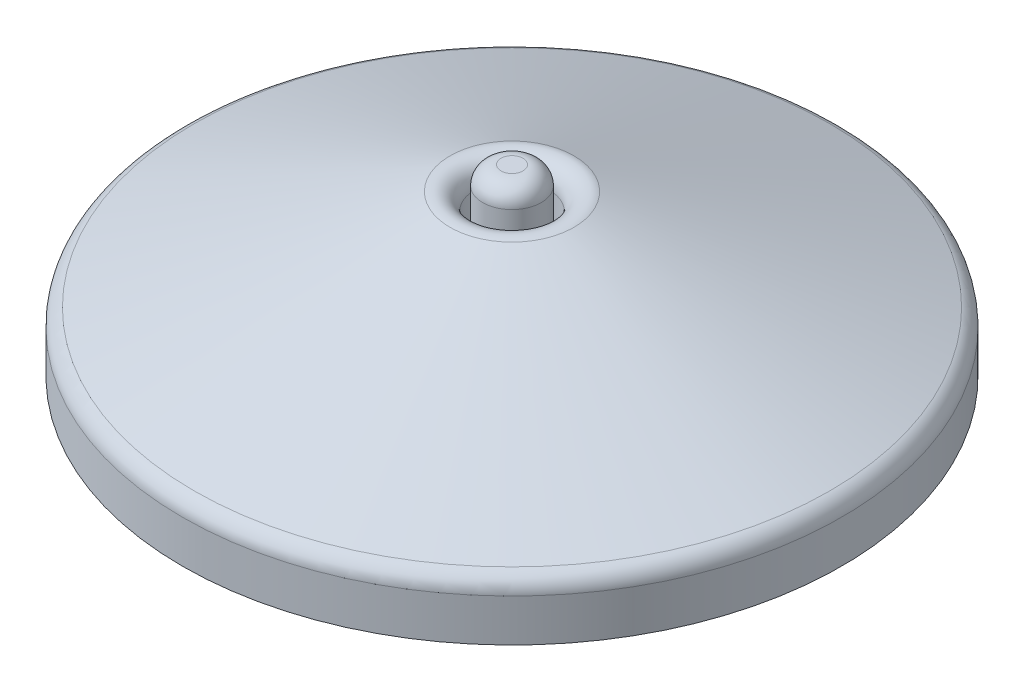
ISO-10303-21;
HEADER;
FILE_DESCRIPTION(('STEP AP214'),'2;1');
FILE_NAME('part.step','',(''),(''),'','','');
FILE_SCHEMA(('AUTOMOTIVE_DESIGN { 1 0 10303 214 1 1 1 1 }'));
ENDSEC;
DATA;
#1=APPLICATION_CONTEXT('core data for automotive mechanical design processes');
#2=APPLICATION_PROTOCOL_DEFINITION('international standard','automotive_design',2000,#1);
#3=PRODUCT_CONTEXT('',#1,'mechanical');
#4=PRODUCT('Part','Part','',(#3));
#5=PRODUCT_RELATED_PRODUCT_CATEGORY('part','',(#4));
#6=PRODUCT_DEFINITION_FORMATION('','',#4);
#7=PRODUCT_DEFINITION_CONTEXT('part definition',#1,'design');
#8=PRODUCT_DEFINITION('design','',#6,#7);
#9=PRODUCT_DEFINITION_SHAPE('','',#8);
#10=(LENGTH_UNIT() NAMED_UNIT(*) SI_UNIT(.MILLI.,.METRE.));
#11=(NAMED_UNIT(*) PLANE_ANGLE_UNIT() SI_UNIT($,.RADIAN.));
#12=(NAMED_UNIT(*) SI_UNIT($,.STERADIAN.) SOLID_ANGLE_UNIT());
#13=UNCERTAINTY_MEASURE_WITH_UNIT(LENGTH_MEASURE(1.E-05),#10,'distance_accuracy_value','');
#14=(GEOMETRIC_REPRESENTATION_CONTEXT(3) GLOBAL_UNCERTAINTY_ASSIGNED_CONTEXT((#13)) GLOBAL_UNIT_ASSIGNED_CONTEXT((#10,
#11,#12)) REPRESENTATION_CONTEXT('',''));
#15=CARTESIAN_POINT('',(0.,0.,0.));
#16=DIRECTION('',(0.,0.,1.));
#17=DIRECTION('',(1.,0.,0.));
#18=AXIS2_PLACEMENT_3D('',#15,#16,#17);
#19=CARTESIAN_POINT('',(0.,0.,0.));
#20=DIRECTION('',(0.,-1.,0.));
#21=DIRECTION('',(0.,0.,-1.));
#22=AXIS2_PLACEMENT_3D('',#19,#20,#21);
#23=CYLINDRICAL_SURFACE('',#22,90.);
#24=CARTESIAN_POINT('',(0.,-3.41162816881988,0.));
#25=DIRECTION('',(0.,-1.,0.));
#26=DIRECTION('',(0.,0.,-1.));
#27=AXIS2_PLACEMENT_3D('',#24,#25,#26);
#28=CIRCLE('',#27,90.);
#29=CARTESIAN_POINT('',(0.,-3.41162816881988,-90.));
#30=VERTEX_POINT('',#29);
#31=EDGE_CURVE('E10',#30,#30,#28,.T.);
#32=ORIENTED_EDGE('',*,*,#31,.T.);
#33=EDGE_LOOP('',(#32));
#34=FACE_BOUND('',#33,.T.);
#35=CARTESIAN_POINT('',(0.,-15.,0.));
#36=DIRECTION('',(0.,-1.,0.));
#37=DIRECTION('',(0.,0.,-1.));
#38=AXIS2_PLACEMENT_3D('',#35,#36,#37);
#39=CIRCLE('',#38,90.);
#40=CARTESIAN_POINT('',(0.,-15.,-90.));
#41=VERTEX_POINT('',#40);
#42=EDGE_CURVE('E72',#41,#41,#39,.T.);
#43=ORIENTED_EDGE('',*,*,#42,.F.);
#44=EDGE_LOOP('',(#43));
#45=FACE_BOUND('',#44,.T.);
#46=ADVANCED_FACE('F41',(#34,#45),#23,.T.);
#47=CARTESIAN_POINT('',(0.,-3.41162816881988,0.));
#48=DIRECTION('',(0.,-1.,0.));
#49=DIRECTION('',(0.,0.,-1.));
#50=AXIS2_PLACEMENT_3D('',#47,#48,#49);
#51=TOROIDAL_SURFACE('',#50,85.,5.);
#52=CARTESIAN_POINT('',(0.,1.24407875048447,0.));
#53=DIRECTION('',(0.,-1.,0.));
#54=DIRECTION('',(0.,0.,-1.));
#55=AXIS2_PLACEMENT_3D('',#52,#53,#54);
#56=CIRCLE('',#55,86.8232918256663);
#57=CARTESIAN_POINT('',(0.,1.24407875048447,-86.8232918256663));
#58=VERTEX_POINT('',#57);
#59=EDGE_CURVE('E47',#58,#58,#56,.T.);
#60=ORIENTED_EDGE('',*,*,#59,.T.);
#61=EDGE_LOOP('',(#60));
#62=FACE_BOUND('',#61,.T.);
#63=ORIENTED_EDGE('',*,*,#31,.F.);
#64=EDGE_LOOP('',(#63));
#65=FACE_BOUND('',#64,.T.);
#66=ADVANCED_FACE('F79',(#62,#65),#51,.T.);
#67=CARTESIAN_POINT('',(0.,28.6186753097368,0.));
#68=DIRECTION('',(0.,-1.,0.));
#69=DIRECTION('',(0.,0.,-1.));
#70=AXIS2_PLACEMENT_3D('',#67,#68,#69);
#71=CONICAL_SURFACE('',#70,16.9232918256663,1.19753044911685);
#72=CARTESIAN_POINT('',(0.,28.6186753097368,0.));
#73=DIRECTION('',(0.,-1.,0.));
#74=DIRECTION('',(0.,0.,-1.));
#75=AXIS2_PLACEMENT_3D('',#72,#73,#74);
#76=CIRCLE('',#75,16.9232918256663);
#77=CARTESIAN_POINT('',(0.,28.6186753097369,-16.9232918256663));
#78=VERTEX_POINT('',#77);
#79=EDGE_CURVE('E51',#78,#78,#76,.T.);
#80=CARTESIAN_POINT('',(0.,1.24407875048447,-86.8232918256663));
#81=CARTESIAN_POINT('',(0.,1.52923079797668,-86.0951668256663));
#82=CARTESIAN_POINT('',(0.,1.81438284546889,-85.3670418256663));
#83=CARTESIAN_POINT('',(0.,2.38468694045331,-83.9107918256663));
#84=CARTESIAN_POINT('',(0.,2.66983898794553,-83.1826668256663));
#85=CARTESIAN_POINT('',(0.,3.24014308292995,-81.7264168256663));
#86=CARTESIAN_POINT('',(0.,3.52529513042216,-80.9982918256663));
#87=CARTESIAN_POINT('',(0.,4.09559922540659,-79.5420418256663));
#88=CARTESIAN_POINT('',(0.,4.3807512728988,-78.8139168256663));
#89=CARTESIAN_POINT('',(0.,4.95105536788323,-77.3576668256663));
#90=CARTESIAN_POINT('',(0.,5.23620741537544,-76.6295418256663));
#91=CARTESIAN_POINT('',(0.,5.80651151035986,-75.1732918256663));
#92=CARTESIAN_POINT('',(0.,6.09166355785207,-74.4451668256663));
#93=CARTESIAN_POINT('',(0.,6.6619676528365,-72.9889168256663));
#94=CARTESIAN_POINT('',(0.,6.94711970032871,-72.2607918256663));
#95=CARTESIAN_POINT('',(0.,7.51742379531314,-70.8045418256663));
#96=CARTESIAN_POINT('',(0.,7.80257584280535,-70.0764168256663));
#97=CARTESIAN_POINT('',(0.,8.37287993778977,-68.6201668256663));
#98=CARTESIAN_POINT('',(0.,8.65803198528199,-67.8920418256663));
#99=CARTESIAN_POINT('',(0.,9.22833608026641,-66.4357918256663));
#100=CARTESIAN_POINT('',(0.,9.51348812775863,-65.7076668256663));
#101=CARTESIAN_POINT('',(0.,10.083792222743,-64.2514168256663));
#102=CARTESIAN_POINT('',(0.,10.3689442702353,-63.5232918256663));
#103=CARTESIAN_POINT('',(0.,10.9392483652197,-62.0670418256663));
#104=CARTESIAN_POINT('',(0.,11.2244004127119,-61.3389168256663));
#105=CARTESIAN_POINT('',(0.,11.7947045076963,-59.8826668256663));
#106=CARTESIAN_POINT('',(0.,12.0798565551885,-59.1545418256663));
#107=CARTESIAN_POINT('',(0.,12.650160650173,-57.6982918256663));
#108=CARTESIAN_POINT('',(0.,12.9353126976652,-56.9701668256663));
#109=CARTESIAN_POINT('',(0.,13.5056167926496,-55.5139168256663));
#110=CARTESIAN_POINT('',(0.,13.7907688401418,-54.7857918256663));
#111=CARTESIAN_POINT('',(0.,14.3610729351262,-53.3295418256663));
#112=CARTESIAN_POINT('',(0.,14.6462249826184,-52.6014168256663));
#113=CARTESIAN_POINT('',(0.,15.2165290776029,-51.1451668256663));
#114=CARTESIAN_POINT('',(0.,15.5016811250951,-50.4170418256663));
#115=CARTESIAN_POINT('',(0.,16.0719852200795,-48.9607918256663));
#116=CARTESIAN_POINT('',(0.,16.3571372675717,-48.2326668256663));
#117=CARTESIAN_POINT('',(0.,16.9274413625561,-46.7764168256663));
#118=CARTESIAN_POINT('',(0.,17.2125934100484,-46.0482918256663));
#119=CARTESIAN_POINT('',(0.,17.7828975050328,-44.5920418256663));
#120=CARTESIAN_POINT('',(0.,18.068049552525,-43.8639168256663));
#121=CARTESIAN_POINT('',(0.,18.6383536475094,-42.4076668256663));
#122=CARTESIAN_POINT('',(0.,18.9235056950016,-41.6795418256663));
#123=CARTESIAN_POINT('',(0.,19.4938097899861,-40.2232918256663));
#124=CARTESIAN_POINT('',(0.,19.7789618374783,-39.4951668256663));
#125=CARTESIAN_POINT('',(0.,20.3492659324627,-38.0389168256663));
#126=CARTESIAN_POINT('',(0.,20.6344179799549,-37.3107918256663));
#127=CARTESIAN_POINT('',(0.,21.2047220749393,-35.8545418256663));
#128=CARTESIAN_POINT('',(0.,21.4898741224315,-35.1264168256663));
#129=CARTESIAN_POINT('',(0.,22.060178217416,-33.6701668256663));
#130=CARTESIAN_POINT('',(0.,22.3453302649082,-32.9420418256663));
#131=CARTESIAN_POINT('',(0.,22.9156343598926,-31.4857918256663));
#132=CARTESIAN_POINT('',(0.,23.2007864073848,-30.7576668256663));
#133=CARTESIAN_POINT('',(0.,23.7710905023692,-29.3014168256663));
#134=CARTESIAN_POINT('',(0.,24.0562425498615,-28.5732918256663));
#135=CARTESIAN_POINT('',(0.,24.6265466448459,-27.1170418256663));
#136=CARTESIAN_POINT('',(0.,24.9116986923381,-26.3889168256663));
#137=CARTESIAN_POINT('',(0.,25.4820027873225,-24.9326668256663));
#138=CARTESIAN_POINT('',(0.,25.7671548348147,-24.2045418256663));
#139=CARTESIAN_POINT('',(0.,26.3374589297992,-22.7482918256663));
#140=CARTESIAN_POINT('',(0.,26.6226109772914,-22.0201668256663));
#141=CARTESIAN_POINT('',(0.,27.1929150722758,-20.5639168256663));
#142=CARTESIAN_POINT('',(0.,27.478067119768,-19.8357918256663));
#143=CARTESIAN_POINT('',(0.,28.0483712147524,-18.3795418256663));
#144=CARTESIAN_POINT('',(0.,28.3335232622446,-17.6514168256663));
#145=CARTESIAN_POINT('',(0.,28.6186753097369,-16.9232918256663));
#146=B_SPLINE_CURVE_WITH_KNOTS('',3,(#80,#81,#82,#83,#84,#85,#86,#87,#88,#89,#90,#91,#92,#93,
#94,#95,#96,#97,#98,#99,#100,#101,#102,#103,#104,#105,#106,#107,#108,#109,#110,#111,#112,#113,
#114,#115,#116,#117,#118,#119,#120,#121,#122,#123,#124,#125,#126,#127,#128,#129,#130,#131,#132,
#133,#134,#135,#136,#137,#138,#139,#140,#141,#142,#143,#144,#145),.UNSPECIFIED.,.F.,.F.,(4,2,2,
2,2,2,2,2,2,2,2,2,2,2,2,2,2,2,2,2,2,2,2,2,2,2,2,2,2,2,2,2,4),(0.,2.34591119872981,
4.69182239745966,7.03773359618947,9.38364479491931,11.7295559936491,14.075467192379,
16.4213783911088,18.7672895898386,21.1132007885684,23.4591119872983,25.8050231860281,
28.1509343847579,30.4968455834877,32.8427567822176,35.1886679809474,37.5345791796772,
39.880490378407,42.2264015771369,44.5723127758667,46.9182239745965,49.2641351733264,
51.6100463720562,53.955957570786,56.3018687695158,58.6477799682457,60.9936911669755,
63.3396023657053,65.6855135644351,68.0314247631649,70.3773359618948,72.7232471606246,
75.0691583593544),.UNSPECIFIED.);
#147=EDGE_CURVE('BSEAM83',#58,#78,#146,.T.);
#148=ORIENTED_EDGE('',*,*,#59,.F.);
#149=ORIENTED_EDGE('',*,*,#79,.T.);
#150=ORIENTED_EDGE('',*,*,#147,.T.);
#151=ORIENTED_EDGE('',*,*,#147,.F.);
#152=EDGE_LOOP('',(#148,#150,#149,#151));
#153=FACE_BOUND('',#152,.T.);
#154=ADVANCED_FACE('F83',(#153),#71,.T.);
#155=CARTESIAN_POINT('',(0.,23.9629683904325,0.));
#156=DIRECTION('',(0.,-1.,0.));
#157=DIRECTION('',(0.,0.,-1.));
#158=AXIS2_PLACEMENT_3D('',#155,#156,#157);
#159=TOROIDAL_SURFACE('',#158,15.1,5.);
#160=ORIENTED_EDGE('',*,*,#79,.F.);
#161=EDGE_LOOP('',(#160));
#162=FACE_BOUND('',#161,.T.);
#163=CARTESIAN_POINT('',(0.,23.9629683904324,0.));
#164=DIRECTION('',(0.,-1.,0.));
#165=DIRECTION('',(0.,0.,-1.));
#166=AXIS2_PLACEMENT_3D('',#163,#164,#165);
#167=CIRCLE('',#166,10.1);
#168=CARTESIAN_POINT('',(0.,23.9629683904324,-10.1));
#169=VERTEX_POINT('',#168);
#170=EDGE_CURVE('E55',#169,#169,#167,.T.);
#171=ORIENTED_EDGE('',*,*,#170,.T.);
#172=EDGE_LOOP('',(#171));
#173=FACE_BOUND('',#172,.T.);
#174=ADVANCED_FACE('F87',(#162,#173),#159,.T.);
#175=CARTESIAN_POINT('',(0.,0.,0.));
#176=DIRECTION('',(0.,-1.,0.));
#177=DIRECTION('',(0.,0.,-1.));
#178=AXIS2_PLACEMENT_3D('',#175,#176,#177);
#179=CYLINDRICAL_SURFACE('',#178,10.1);
#180=ORIENTED_EDGE('',*,*,#170,.F.);
#181=EDGE_LOOP('',(#180));
#182=FACE_BOUND('',#181,.T.);
#183=CARTESIAN_POINT('',(0.,0.,0.));
#184=DIRECTION('',(0.,-1.,0.));
#185=DIRECTION('',(0.,0.,-1.));
#186=AXIS2_PLACEMENT_3D('',#183,#184,#185);
#187=CIRCLE('',#186,10.1);
#188=CARTESIAN_POINT('',(0.,0.,-10.1));
#189=VERTEX_POINT('',#188);
#190=EDGE_CURVE('E60',#189,#189,#187,.T.);
#191=ORIENTED_EDGE('',*,*,#190,.T.);
#192=EDGE_LOOP('',(#191));
#193=FACE_BOUND('',#192,.T.);
#194=ADVANCED_FACE('F94',(#182,#193),#179,.F.);
#195=CARTESIAN_POINT('',(0.,0.,0.));
#196=DIRECTION('',(0.,-1.,0.));
#197=DIRECTION('',(0.,0.,-1.));
#198=AXIS2_PLACEMENT_3D('',#195,#196,#197);
#199=PLANE('',#198);
#200=ORIENTED_EDGE('',*,*,#190,.F.);
#201=EDGE_LOOP('',(#200));
#202=FACE_BOUND('',#201,.T.);
#203=CARTESIAN_POINT('',(0.,0.,0.));
#204=DIRECTION('',(0.,-1.,0.));
#205=DIRECTION('',(0.,0.,-1.));
#206=AXIS2_PLACEMENT_3D('',#203,#204,#205);
#207=CIRCLE('',#206,8.);
#208=CARTESIAN_POINT('',(0.,0.,-8.));
#209=VERTEX_POINT('',#208);
#210=EDGE_CURVE('E63',#209,#209,#207,.T.);
#211=ORIENTED_EDGE('',*,*,#210,.T.);
#212=EDGE_LOOP('',(#211));
#213=FACE_BOUND('',#212,.T.);
#214=ADVANCED_FACE('F98',(#202,#213),#199,.F.);
#215=CARTESIAN_POINT('',(0.,0.,0.));
#216=DIRECTION('',(0.,-1.,0.));
#217=DIRECTION('',(0.,0.,-1.));
#218=AXIS2_PLACEMENT_3D('',#215,#216,#217);
#219=CYLINDRICAL_SURFACE('',#218,8.);
#220=ORIENTED_EDGE('',*,*,#210,.F.);
#221=EDGE_LOOP('',(#220));
#222=FACE_BOUND('',#221,.T.);
#223=CARTESIAN_POINT('',(0.,30.,0.));
#224=DIRECTION('',(0.,-1.,0.));
#225=DIRECTION('',(0.,0.,-1.));
#226=AXIS2_PLACEMENT_3D('',#223,#224,#225);
#227=CIRCLE('',#226,8.);
#228=CARTESIAN_POINT('',(0.,30.,-8.));
#229=VERTEX_POINT('',#228);
#230=EDGE_CURVE('E66',#229,#229,#227,.T.);
#231=ORIENTED_EDGE('',*,*,#230,.T.);
#232=EDGE_LOOP('',(#231));
#233=FACE_BOUND('',#232,.T.);
#234=ADVANCED_FACE('F102',(#222,#233),#219,.T.);
#235=CARTESIAN_POINT('',(0.,30.,0.));
#236=DIRECTION('',(0.,-1.,0.));
#237=DIRECTION('',(0.,0.,-1.));
#238=AXIS2_PLACEMENT_3D('',#235,#236,#237);
#239=DEGENERATE_TOROIDAL_SURFACE('',#238,3.,5.,.T.);
#240=ORIENTED_EDGE('',*,*,#230,.F.);
#241=EDGE_LOOP('',(#240));
#242=FACE_BOUND('',#241,.T.);
#243=CARTESIAN_POINT('',(0.,35.,0.));
#244=DIRECTION('',(0.,-1.,0.));
#245=DIRECTION('',(0.,0.,-1.));
#246=AXIS2_PLACEMENT_3D('',#243,#244,#245);
#247=CIRCLE('',#246,2.99999999999996);
#248=CARTESIAN_POINT('',(0.,35.,-2.99999999999996));
#249=VERTEX_POINT('',#248);
#250=EDGE_CURVE('E69',#249,#249,#247,.T.);
#251=ORIENTED_EDGE('',*,*,#250,.T.);
#252=EDGE_LOOP('',(#251));
#253=FACE_BOUND('',#252,.T.);
#254=ADVANCED_FACE('F106',(#242,#253),#239,.T.);
#255=CARTESIAN_POINT('',(0.,35.,0.));
#256=DIRECTION('',(0.,-1.,0.));
#257=DIRECTION('',(0.,0.,-1.));
#258=AXIS2_PLACEMENT_3D('',#255,#256,#257);
#259=PLANE('',#258);
#260=ORIENTED_EDGE('',*,*,#250,.F.);
#261=EDGE_LOOP('',(#260));
#262=FACE_BOUND('',#261,.T.);
#263=ADVANCED_FACE('F110',(#262),#259,.F.);
#264=CARTESIAN_POINT('',(0.,-15.,0.));
#265=DIRECTION('',(0.,-1.,0.));
#266=DIRECTION('',(0.,0.,-1.));
#267=AXIS2_PLACEMENT_3D('',#264,#265,#266);
#268=PLANE('',#267);
#269=ORIENTED_EDGE('',*,*,#42,.T.);
#270=EDGE_LOOP('',(#269));
#271=FACE_BOUND('',#270,.T.);
#272=ADVANCED_FACE('F76',(#271),#268,.T.);
#273=CLOSED_SHELL('',(#46,#66,#154,#174,#194,#214,#234,#254,#263,#272));
#274=MANIFOLD_SOLID_BREP('B2',#273);
#275=ADVANCED_BREP_SHAPE_REPRESENTATION('',(#18,#274),#14);
#276=SHAPE_DEFINITION_REPRESENTATION(#9,#275);
ENDSEC;
END-ISO-10303-21;
